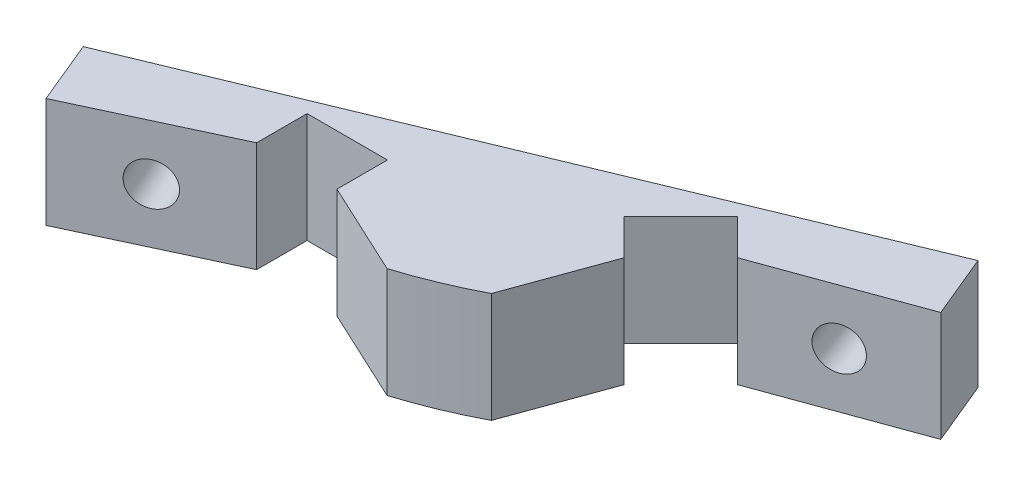
ISO-10303-21;
HEADER;
FILE_DESCRIPTION(('STEP AP214'),'2;1');
FILE_NAME('part.step','',(''),(''),'','','');
FILE_SCHEMA(('AUTOMOTIVE_DESIGN { 1 0 10303 214 1 1 1 1 }'));
ENDSEC;
DATA;
#1=APPLICATION_CONTEXT('core data for automotive mechanical design processes');
#2=APPLICATION_PROTOCOL_DEFINITION('international standard','automotive_design',2000,#1);
#3=PRODUCT_CONTEXT('',#1,'mechanical');
#4=PRODUCT('Part','Part','',(#3));
#5=PRODUCT_RELATED_PRODUCT_CATEGORY('part','',(#4));
#6=PRODUCT_DEFINITION_FORMATION('','',#4);
#7=PRODUCT_DEFINITION_CONTEXT('part definition',#1,'design');
#8=PRODUCT_DEFINITION('design','',#6,#7);
#9=PRODUCT_DEFINITION_SHAPE('','',#8);
#10=(LENGTH_UNIT() NAMED_UNIT(*) SI_UNIT(.MILLI.,.METRE.));
#11=(NAMED_UNIT(*) PLANE_ANGLE_UNIT() SI_UNIT($,.RADIAN.));
#12=(NAMED_UNIT(*) SI_UNIT($,.STERADIAN.) SOLID_ANGLE_UNIT());
#13=UNCERTAINTY_MEASURE_WITH_UNIT(LENGTH_MEASURE(1.E-05),#10,'distance_accuracy_value','');
#14=(GEOMETRIC_REPRESENTATION_CONTEXT(3) GLOBAL_UNCERTAINTY_ASSIGNED_CONTEXT((#13)) GLOBAL_UNIT_ASSIGNED_CONTEXT((#10,
#11,#12)) REPRESENTATION_CONTEXT('',''));
#15=CARTESIAN_POINT('',(0.,0.,0.));
#16=DIRECTION('',(0.,0.,1.));
#17=DIRECTION('',(1.,0.,0.));
#18=AXIS2_PLACEMENT_3D('',#15,#16,#17);
#19=CARTESIAN_POINT('',(20.7924749007934,7.62,12.6238901295778));
#20=DIRECTION('',(-0.342020143325609,0.,-0.93969262078593));
#21=DIRECTION('',(-0.93969262078593,0.,0.342020143325609));
#22=AXIS2_PLACEMENT_3D('',#19,#20,#21);
#23=PLANE('',#22);
#24=DIRECTION('',(0.93969262078593,0.,-0.342020143325609));
#25=VECTOR('',#24,1.);
#26=CARTESIAN_POINT('',(20.7924749007934,0.,12.6238901295778));
#27=LINE('',#26,#25);
#28=CARTESIAN_POINT('',(20.7924749007934,0.,12.6238901295778));
#29=VERTEX_POINT('',#28);
#30=CARTESIAN_POINT('',(31.1144144441,0.,8.86701137591858));
#31=VERTEX_POINT('',#30);
#32=EDGE_CURVE('E282',#29,#31,#27,.T.);
#33=ORIENTED_EDGE('',*,*,#32,.T.);
#34=DIRECTION('',(0.,1.,0.));
#35=VECTOR('',#34,1.);
#36=CARTESIAN_POINT('',(31.1144144441,-10.570963632343,8.86701137591858));
#37=LINE('',#36,#35);
#38=CARTESIAN_POINT('',(31.1144144441,7.62,8.86701137591858));
#39=VERTEX_POINT('',#38);
#40=EDGE_CURVE('E226',#31,#39,#37,.T.);
#41=ORIENTED_EDGE('',*,*,#40,.T.);
#42=DIRECTION('',(0.93969262078593,0.,-0.342020143325609));
#43=VECTOR('',#42,1.);
#44=CARTESIAN_POINT('',(20.7924749007934,7.62,12.6238901295778));
#45=LINE('',#44,#43);
#46=CARTESIAN_POINT('',(20.7924749007934,7.62,12.6238901295778));
#47=VERTEX_POINT('',#46);
#48=EDGE_CURVE('E164',#47,#39,#45,.T.);
#49=ORIENTED_EDGE('',*,*,#48,.F.);
#50=DIRECTION('',(0.,-1.,0.));
#51=VECTOR('',#50,1.);
#52=CARTESIAN_POINT('',(20.7924749007934,7.62,12.6238901295778));
#53=LINE('',#52,#51);
#54=EDGE_CURVE('E293',#47,#29,#53,.T.);
#55=ORIENTED_EDGE('',*,*,#54,.T.);
#56=EDGE_LOOP('',(#33,#41,#49,#55));
#57=FACE_BOUND('',#56,.T.);
#58=CARTESIAN_POINT('',(25.9534446724455,3.81,10.7454507527495));
#59=DIRECTION('',(-0.342020143325853,0.,-0.939692620785841));
#60=DIRECTION('',(-0.939692620785841,0.,0.342020143325853));
#61=AXIS2_PLACEMENT_3D('',#58,#59,#60);
#62=CIRCLE('',#61,1.4732);
#63=CARTESIAN_POINT('',(24.5690895035038,3.81,11.2493148278971));
#64=VERTEX_POINT('',#63);
#65=EDGE_CURVE('E205',#64,#64,#62,.T.);
#66=ORIENTED_EDGE('',*,*,#65,.T.);
#67=EDGE_LOOP('',(#66));
#68=FACE_BOUND('',#67,.T.);
#69=ADVANCED_FACE('F37',(#57,#68),#23,.F.);
#70=CARTESIAN_POINT('',(22.2179051641357,5.461,7.38974578558781));
#71=DIRECTION('',(0.382683432365178,0.,0.92387953251125));
#72=DIRECTION('',(0.92387953251125,0.,-0.382683432365178));
#73=AXIS2_PLACEMENT_3D('',#70,#71,#72);
#74=PLANE('',#73);
#75=DIRECTION('',(0.92387953251125,0.,-0.382683432365178));
#76=VECTOR('',#75,1.);
#77=CARTESIAN_POINT('',(22.2179051641357,7.62,7.38974578558781));
#78=LINE('',#77,#76);
#79=CARTESIAN_POINT('',(-14.5653837667516,7.62,22.6258829294536));
#80=VERTEX_POINT('',#79);
#81=CARTESIAN_POINT('',(29.2892585662248,7.62,4.46069530210858));
#82=VERTEX_POINT('',#81);
#83=EDGE_CURVE('E233',#80,#82,#78,.T.);
#84=ORIENTED_EDGE('',*,*,#83,.T.);
#85=DIRECTION('',(0.,1.,0.));
#86=VECTOR('',#85,1.);
#87=CARTESIAN_POINT('',(29.2892585662248,-10.570963632343,4.46069530210858));
#88=LINE('',#87,#86);
#89=CARTESIAN_POINT('',(29.2892585662248,0.,4.46069530210858));
#90=VERTEX_POINT('',#89);
#91=EDGE_CURVE('E229',#90,#82,#88,.T.);
#92=ORIENTED_EDGE('',*,*,#91,.F.);
#93=DIRECTION('',(0.923879532511251,0.,-0.382683432365177));
#94=VECTOR('',#93,1.);
#95=CARTESIAN_POINT('',(22.2179051641357,0.,7.38974578558781));
#96=LINE('',#95,#94);
#97=CARTESIAN_POINT('',(22.2179051641357,0.,7.38974578558781));
#98=VERTEX_POINT('',#97);
#99=EDGE_CURVE('E223',#98,#90,#96,.T.);
#100=ORIENTED_EDGE('',*,*,#99,.F.);
#101=DIRECTION('',(0.,1.,0.));
#102=VECTOR('',#101,1.);
#103=CARTESIAN_POINT('',(22.2179051641357,-10.570963632343,7.38974578558781));
#104=LINE('',#103,#102);
#105=CARTESIAN_POINT('',(22.2179051641357,5.461,7.38974578558781));
#106=VERTEX_POINT('',#105);
#107=EDGE_CURVE('E54',#98,#106,#104,.T.);
#108=ORIENTED_EDGE('',*,*,#107,.T.);
#109=DIRECTION('',(0.92387953251125,0.,-0.382683432365178));
#110=VECTOR('',#109,1.);
#111=CARTESIAN_POINT('',(22.2179051641357,5.461,7.38974578558781));
#112=LINE('',#111,#110);
#113=CARTESIAN_POINT('',(-7.49403036466243,5.461,19.6968324459743));
#114=VERTEX_POINT('',#113);
#115=EDGE_CURVE('E177',#114,#106,#112,.T.);
#116=ORIENTED_EDGE('',*,*,#115,.F.);
#117=DIRECTION('',(0.,1.,0.));
#118=VECTOR('',#117,1.);
#119=CARTESIAN_POINT('',(-7.49403036466243,-10.570963632343,19.6968324459743));
#120=LINE('',#119,#118);
#121=CARTESIAN_POINT('',(-7.49403036466243,0.,19.6968324459743));
#122=VERTEX_POINT('',#121);
#123=EDGE_CURVE('E198',#122,#114,#120,.T.);
#124=ORIENTED_EDGE('',*,*,#123,.F.);
#125=DIRECTION('',(0.92387953251125,0.,-0.382683432365178));
#126=VECTOR('',#125,1.);
#127=CARTESIAN_POINT('',(-7.49403036466243,0.,19.6968324459743));
#128=LINE('',#127,#126);
#129=CARTESIAN_POINT('',(-14.5653837667516,0.,22.6258829294536));
#130=VERTEX_POINT('',#129);
#131=EDGE_CURVE('E186',#130,#122,#128,.T.);
#132=ORIENTED_EDGE('',*,*,#131,.F.);
#133=DIRECTION('',(0.,1.,0.));
#134=VECTOR('',#133,1.);
#135=CARTESIAN_POINT('',(-14.5653837667516,-10.570963632343,22.6258829294536));
#136=LINE('',#135,#134);
#137=EDGE_CURVE('E213',#130,#80,#136,.T.);
#138=ORIENTED_EDGE('',*,*,#137,.T.);
#139=EDGE_LOOP('',(#84,#92,#100,#108,#116,#124,#132,#138));
#140=FACE_BOUND('',#139,.T.);
#141=CARTESIAN_POINT('',(-9.67881234402094,3.81,20.6017987726532));
#142=DIRECTION('',(0.382683432365178,0.,0.92387953251125));
#143=DIRECTION('',(0.92387953251125,0.,-0.382683432365178));
#144=AXIS2_PLACEMENT_3D('',#141,#142,#143);
#145=ELLIPSE('',#144,1.4746034957826,1.4732);
#146=CARTESIAN_POINT('',(-8.31645635569786,3.81,20.0374924455094));
#147=VERTEX_POINT('',#146);
#148=EDGE_CURVE('E192',#147,#147,#145,.T.);
#149=ORIENTED_EDGE('',*,*,#148,.T.);
#150=EDGE_LOOP('',(#149));
#151=FACE_BOUND('',#150,.T.);
#152=CARTESIAN_POINT('',(24.4026871434941,3.81,6.48477945890895));
#153=DIRECTION('',(0.382683432365178,0.,0.92387953251125));
#154=DIRECTION('',(-0.92387953251125,0.,0.382683432365178));
#155=AXIS2_PLACEMENT_3D('',#152,#153,#154);
#156=ELLIPSE('',#155,1.4746034957826,1.4732);
#157=CARTESIAN_POINT('',(23.0403311551711,3.81,7.04908578605272));
#158=VERTEX_POINT('',#157);
#159=EDGE_CURVE('E41',#158,#158,#156,.F.);
#160=ORIENTED_EDGE('',*,*,#159,.F.);
#161=EDGE_LOOP('',(#160));
#162=FACE_BOUND('',#161,.T.);
#163=ADVANCED_FACE('F349',(#140,#151,#162),#74,.F.);
#164=CARTESIAN_POINT('',(27.5341855589059,7.62,10.1701081219901));
#165=DIRECTION('',(-0.463437159403285,0.,0.886129786929778));
#166=DIRECTION('',(0.886129786929778,0.,0.463437159403285));
#167=AXIS2_PLACEMENT_3D('',#164,#165,#166);
#168=PLANE('',#167);
#169=ORIENTED_EDGE('',*,*,#107,.F.);
#170=DIRECTION('',(-0.886129786929778,0.,-0.463437159403285));
#171=VECTOR('',#170,1.);
#172=CARTESIAN_POINT('',(27.5341855589059,0.,10.1701081219901));
#173=LINE('',#172,#171);
#174=CARTESIAN_POINT('',(19.152394428167,0.,5.78651383406991));
#175=VERTEX_POINT('',#174);
#176=EDGE_CURVE('E279',#98,#175,#173,.T.);
#177=ORIENTED_EDGE('',*,*,#176,.T.);
#178=DIRECTION('',(0.,-1.,0.));
#179=VECTOR('',#178,1.);
#180=CARTESIAN_POINT('',(19.152394428167,7.62,5.78651383406991));
#181=LINE('',#180,#179);
#182=CARTESIAN_POINT('',(19.152394428167,5.461,5.78651383406991));
#183=VERTEX_POINT('',#182);
#184=EDGE_CURVE('E290',#183,#175,#181,.T.);
#185=ORIENTED_EDGE('',*,*,#184,.F.);
#186=DIRECTION('',(-0.886129786929778,0.,-0.463437159403285));
#187=VECTOR('',#186,1.);
#188=CARTESIAN_POINT('',(19.1505615139966,5.461,5.7855552379939));
#189=LINE('',#188,#187);
#190=EDGE_CURVE('E183',#106,#183,#189,.T.);
#191=ORIENTED_EDGE('',*,*,#190,.F.);
#192=EDGE_LOOP('',(#169,#177,#185,#191));
#193=FACE_BOUND('',#192,.T.);
#194=ADVANCED_FACE('F355',(#193),#168,.F.);
#195=CARTESIAN_POINT('',(-9.28719522026678,7.62,25.4220234260315));
#196=DIRECTION('',(0.954287939417387,0.,0.298888823281361));
#197=DIRECTION('',(0.298888823281361,0.,-0.954287939417388));
#198=AXIS2_PLACEMENT_3D('',#195,#196,#197);
#199=PLANE('',#198);
#200=DIRECTION('',(-0.298888823281361,0.,0.954287939417387));
#201=VECTOR('',#200,1.);
#202=CARTESIAN_POINT('',(-9.28719522026678,0.,25.4220234260315));
#203=LINE('',#202,#201);
#204=CARTESIAN_POINT('',(-6.46004312019274,0.,16.3955328320373));
#205=VERTEX_POINT('',#204);
#206=EDGE_CURVE('E174',#205,#122,#203,.T.);
#207=ORIENTED_EDGE('',*,*,#206,.T.);
#208=ORIENTED_EDGE('',*,*,#123,.T.);
#209=DIRECTION('',(-0.298888823281361,0.,0.954287939417388));
#210=VECTOR('',#209,1.);
#211=CARTESIAN_POINT('',(-6.45942488393924,5.461,16.3935589362123));
#212=LINE('',#211,#210);
#213=CARTESIAN_POINT('',(-6.46004312019274,5.461,16.3955328320373));
#214=VERTEX_POINT('',#213);
#215=EDGE_CURVE('E180',#214,#114,#212,.T.);
#216=ORIENTED_EDGE('',*,*,#215,.F.);
#217=DIRECTION('',(0.,-1.,0.));
#218=VECTOR('',#217,1.);
#219=CARTESIAN_POINT('',(-6.46004312019274,7.62,16.3955328320373));
#220=LINE('',#219,#218);
#221=EDGE_CURVE('E108',#214,#205,#220,.T.);
#222=ORIENTED_EDGE('',*,*,#221,.T.);
#223=EDGE_LOOP('',(#207,#208,#216,#222));
#224=FACE_BOUND('',#223,.T.);
#225=ADVANCED_FACE('F39',(#224),#199,.F.);
#226=CARTESIAN_POINT('',(-2.78499999999602,7.62,22.3900000000004));
#227=DIRECTION('',(-0.422618261740698,0.,-0.906307787036651));
#228=DIRECTION('',(-0.906307787036651,0.,0.422618261740698));
#229=AXIS2_PLACEMENT_3D('',#226,#227,#228);
#230=PLANE('',#229);
#231=CARTESIAN_POINT('',(-7.76261394443621,3.81,24.711099501632));
#232=DIRECTION('',(0.422618261740698,0.,0.906307787036651));
#233=DIRECTION('',(0.906307787036651,0.,-0.422618261740698));
#234=AXIS2_PLACEMENT_3D('',#231,#232,#233);
#235=CIRCLE('',#234,1.4732);
#236=CARTESIAN_POINT('',(-6.42744131257382,3.81,24.0884982784356));
#237=VERTEX_POINT('',#236);
#238=EDGE_CURVE('E195',#237,#237,#235,.T.);
#239=ORIENTED_EDGE('',*,*,#238,.F.);
#240=EDGE_LOOP('',(#239));
#241=FACE_BOUND('',#240,.T.);
#242=DIRECTION('',(0.906307787036651,0.,-0.422618261740698));
#243=VECTOR('',#242,1.);
#244=CARTESIAN_POINT('',(-2.78499999999602,0.,22.3900000000004));
#245=LINE('',#244,#243);
#246=CARTESIAN_POINT('',(-12.7402278888764,0.,27.0321990032636));
#247=VERTEX_POINT('',#246);
#248=CARTESIAN_POINT('',(-2.78499999999602,0.,22.3900000000004));
#249=VERTEX_POINT('',#248);
#250=EDGE_CURVE('E171',#247,#249,#245,.T.);
#251=ORIENTED_EDGE('',*,*,#250,.T.);
#252=DIRECTION('',(0.,-1.,0.));
#253=VECTOR('',#252,1.);
#254=CARTESIAN_POINT('',(-2.78499999999602,7.62,22.3900000000004));
#255=LINE('',#254,#253);
#256=CARTESIAN_POINT('',(-2.78499999999602,7.62,22.3900000000004));
#257=VERTEX_POINT('',#256);
#258=EDGE_CURVE('E46',#257,#249,#255,.T.);
#259=ORIENTED_EDGE('',*,*,#258,.F.);
#260=DIRECTION('',(0.906307787036651,0.,-0.422618261740698));
#261=VECTOR('',#260,1.);
#262=CARTESIAN_POINT('',(-2.78499999999602,7.62,22.3900000000004));
#263=LINE('',#262,#261);
#264=CARTESIAN_POINT('',(-12.7402278888764,7.62,27.0321990032636));
#265=VERTEX_POINT('',#264);
#266=EDGE_CURVE('E116',#265,#257,#263,.T.);
#267=ORIENTED_EDGE('',*,*,#266,.F.);
#268=DIRECTION('',(0.,1.,0.));
#269=VECTOR('',#268,1.);
#270=CARTESIAN_POINT('',(-12.7402278888764,-10.570963632343,27.0321990032636));
#271=LINE('',#270,#269);
#272=EDGE_CURVE('E190',#247,#265,#271,.T.);
#273=ORIENTED_EDGE('',*,*,#272,.F.);
#274=EDGE_LOOP('',(#251,#259,#267,#273));
#275=FACE_BOUND('',#274,.T.);
#276=ADVANCED_FACE('F323',(#241,#275),#230,.F.);
#277=CARTESIAN_POINT('',(-2.78499999999602,7.62,18.8900000000005));
#278=DIRECTION('',(-1.,0.,0.));
#279=DIRECTION('',(0.,0.,1.));
#280=AXIS2_PLACEMENT_3D('',#277,#278,#279);
#281=PLANE('',#280);
#282=DIRECTION('',(0.,0.,-1.));
#283=VECTOR('',#282,1.);
#284=CARTESIAN_POINT('',(-2.78499999999602,0.,18.8900000000005));
#285=LINE('',#284,#283);
#286=CARTESIAN_POINT('',(-2.78499999999602,0.,18.8900000000005));
#287=VERTEX_POINT('',#286);
#288=EDGE_CURVE('E315',#249,#287,#285,.T.);
#289=ORIENTED_EDGE('',*,*,#288,.T.);
#290=DIRECTION('',(0.,-1.,0.));
#291=VECTOR('',#290,1.);
#292=CARTESIAN_POINT('',(-2.78499999999602,7.62,18.8900000000005));
#293=LINE('',#292,#291);
#294=CARTESIAN_POINT('',(-2.78499999999602,7.62,18.8900000000005));
#295=VERTEX_POINT('',#294);
#296=EDGE_CURVE('E274',#295,#287,#293,.T.);
#297=ORIENTED_EDGE('',*,*,#296,.F.);
#298=DIRECTION('',(0.,0.,-1.));
#299=VECTOR('',#298,1.);
#300=CARTESIAN_POINT('',(-2.78499999999602,7.62,18.8900000000005));
#301=LINE('',#300,#299);
#302=EDGE_CURVE('E237',#257,#295,#301,.T.);
#303=ORIENTED_EDGE('',*,*,#302,.F.);
#304=ORIENTED_EDGE('',*,*,#258,.T.);
#305=EDGE_LOOP('',(#289,#297,#303,#304));
#306=FACE_BOUND('',#305,.T.);
#307=ADVANCED_FACE('F327',(#306),#281,.F.);
#308=CARTESIAN_POINT('',(1.49211910891068E-12,7.62,18.8900000000005));
#309=DIRECTION('',(0.,0.,-1.));
#310=DIRECTION('',(-1.,0.,0.));
#311=AXIS2_PLACEMENT_3D('',#308,#309,#310);
#312=PLANE('',#311);
#313=DIRECTION('',(1.,0.,0.));
#314=VECTOR('',#313,1.);
#315=CARTESIAN_POINT('',(1.49211910891068E-12,0.,18.8900000000005));
#316=LINE('',#315,#314);
#317=CARTESIAN_POINT('',(2.78500000000462,0.,18.8900000000005));
#318=VERTEX_POINT('',#317);
#319=EDGE_CURVE('E314',#287,#318,#316,.T.);
#320=ORIENTED_EDGE('',*,*,#319,.T.);
#321=DIRECTION('',(0.,-1.,0.));
#322=VECTOR('',#321,1.);
#323=CARTESIAN_POINT('',(2.78500000000462,7.62,18.8900000000005));
#324=LINE('',#323,#322);
#325=CARTESIAN_POINT('',(2.78500000000462,7.62,18.8900000000005));
#326=VERTEX_POINT('',#325);
#327=EDGE_CURVE('E271',#326,#318,#324,.T.);
#328=ORIENTED_EDGE('',*,*,#327,.F.);
#329=DIRECTION('',(1.,0.,0.));
#330=VECTOR('',#329,1.);
#331=CARTESIAN_POINT('',(1.49211910891068E-12,7.62,18.8900000000005));
#332=LINE('',#331,#330);
#333=EDGE_CURVE('E240',#295,#326,#332,.T.);
#334=ORIENTED_EDGE('',*,*,#333,.F.);
#335=ORIENTED_EDGE('',*,*,#296,.T.);
#336=EDGE_LOOP('',(#320,#328,#334,#335));
#337=FACE_BOUND('',#336,.T.);
#338=ADVANCED_FACE('F332',(#337),#312,.F.);
#339=CARTESIAN_POINT('',(2.78500000000462,7.62,18.8900000000005));
#340=DIRECTION('',(1.,0.,0.));
#341=DIRECTION('',(0.,0.,-1.));
#342=AXIS2_PLACEMENT_3D('',#339,#340,#341);
#343=PLANE('',#342);
#344=DIRECTION('',(0.,0.,1.));
#345=VECTOR('',#344,1.);
#346=CARTESIAN_POINT('',(2.78500000000462,0.,18.8900000000005));
#347=LINE('',#346,#345);
#348=CARTESIAN_POINT('',(2.78500000000462,0.,22.3899999999995));
#349=VERTEX_POINT('',#348);
#350=EDGE_CURVE('E312',#318,#349,#347,.T.);
#351=ORIENTED_EDGE('',*,*,#350,.T.);
#352=DIRECTION('',(0.,-1.,0.));
#353=VECTOR('',#352,1.);
#354=CARTESIAN_POINT('',(2.78500000000462,7.62,22.3899999999995));
#355=LINE('',#354,#353);
#356=CARTESIAN_POINT('',(2.78500000000462,7.62,22.3899999999995));
#357=VERTEX_POINT('',#356);
#358=EDGE_CURVE('E268',#357,#349,#355,.T.);
#359=ORIENTED_EDGE('',*,*,#358,.F.);
#360=DIRECTION('',(0.,0.,1.));
#361=VECTOR('',#360,1.);
#362=CARTESIAN_POINT('',(2.78500000000462,7.62,18.8900000000005));
#363=LINE('',#362,#361);
#364=EDGE_CURVE('E242',#326,#357,#363,.T.);
#365=ORIENTED_EDGE('',*,*,#364,.F.);
#366=ORIENTED_EDGE('',*,*,#327,.T.);
#367=EDGE_LOOP('',(#351,#359,#365,#366));
#368=FACE_BOUND('',#367,.T.);
#369=ADVANCED_FACE('F336',(#368),#343,.F.);
#370=CARTESIAN_POINT('',(2.78500000000462,7.62,22.3899999999995));
#371=DIRECTION('',(0.422618261740758,0.,-0.906307787036623));
#372=DIRECTION('',(-0.906307787036623,0.,-0.422618261740758));
#373=AXIS2_PLACEMENT_3D('',#370,#371,#372);
#374=PLANE('',#373);
#375=DIRECTION('',(0.906307787036623,0.,0.422618261740758));
#376=VECTOR('',#375,1.);
#377=CARTESIAN_POINT('',(2.78500000000462,0.,22.3899999999995));
#378=LINE('',#377,#376);
#379=CARTESIAN_POINT('',(9.28719522027243,0.,25.4220234260297));
#380=VERTEX_POINT('',#379);
#381=EDGE_CURVE('E310',#349,#380,#378,.T.);
#382=ORIENTED_EDGE('',*,*,#381,.T.);
#383=DIRECTION('',(0.,-1.,0.));
#384=VECTOR('',#383,1.);
#385=CARTESIAN_POINT('',(9.28719522027243,7.62,25.4220234260297));
#386=LINE('',#385,#384);
#387=CARTESIAN_POINT('',(9.28719522027243,7.62,25.4220234260297));
#388=VERTEX_POINT('',#387);
#389=EDGE_CURVE('E260',#388,#380,#386,.T.);
#390=ORIENTED_EDGE('',*,*,#389,.F.);
#391=DIRECTION('',(0.906307787036623,0.,0.422618261740758));
#392=VECTOR('',#391,1.);
#393=CARTESIAN_POINT('',(2.78500000000462,7.62,22.3899999999995));
#394=LINE('',#393,#392);
#395=EDGE_CURVE('E244',#357,#388,#394,.T.);
#396=ORIENTED_EDGE('',*,*,#395,.F.);
#397=ORIENTED_EDGE('',*,*,#358,.T.);
#398=EDGE_LOOP('',(#382,#390,#396,#397));
#399=FACE_BOUND('',#398,.T.);
#400=ADVANCED_FACE('F339',(#399),#374,.F.);
#401=CARTESIAN_POINT('',(1.48928772551105E-12,7.62,-4.22999999999638));
#402=DIRECTION('',(0.,-1.,0.));
#403=DIRECTION('',(0.,0.,-1.));
#404=AXIS2_PLACEMENT_3D('',#401,#402,#403);
#405=CYLINDRICAL_SURFACE('',#404,31.0724071857496);
#406=CARTESIAN_POINT('',(1.48928772551105E-12,0.,-4.22999999999638));
#407=DIRECTION('',(0.,1.,0.));
#408=DIRECTION('',(0.,0.,1.));
#409=AXIS2_PLACEMENT_3D('',#406,#407,#408);
#410=CIRCLE('',#409,31.0724071857496);
#411=CARTESIAN_POINT('',(14.4001081219953,0.,23.3041855589032));
#412=VERTEX_POINT('',#411);
#413=EDGE_CURVE('E257',#380,#412,#410,.T.);
#414=ORIENTED_EDGE('',*,*,#413,.T.);
#415=DIRECTION('',(0.,-1.,0.));
#416=VECTOR('',#415,1.);
#417=CARTESIAN_POINT('',(14.4001081219953,7.62,23.3041855589032));
#418=LINE('',#417,#416);
#419=CARTESIAN_POINT('',(14.4001081219953,7.62,23.3041855589032));
#420=VERTEX_POINT('',#419);
#421=EDGE_CURVE('E254',#420,#412,#418,.T.);
#422=ORIENTED_EDGE('',*,*,#421,.F.);
#423=CARTESIAN_POINT('',(1.48928772551105E-12,7.62,-4.22999999999638));
#424=DIRECTION('',(0.,1.,0.));
#425=DIRECTION('',(0.,0.,1.));
#426=AXIS2_PLACEMENT_3D('',#423,#424,#425);
#427=CIRCLE('',#426,31.0724071857496);
#428=EDGE_CURVE('E246',#388,#420,#427,.T.);
#429=ORIENTED_EDGE('',*,*,#428,.F.);
#430=ORIENTED_EDGE('',*,*,#389,.T.);
#431=EDGE_LOOP('',(#414,#422,#429,#430));
#432=FACE_BOUND('',#431,.T.);
#433=ADVANCED_FACE('F255',(#432),#405,.T.);
#434=CARTESIAN_POINT('',(16.8538901295845,7.62,16.5624749007879));
#435=DIRECTION('',(-0.939692620785908,0.,-0.34202014332567));
#436=DIRECTION('',(-0.34202014332567,0.,0.939692620785908));
#437=AXIS2_PLACEMENT_3D('',#434,#435,#436);
#438=PLANE('',#437);
#439=DIRECTION('',(0.34202014332567,0.,-0.939692620785908));
#440=VECTOR('',#439,1.);
#441=CARTESIAN_POINT('',(16.8538901295845,0.,16.5624749007879));
#442=LINE('',#441,#440);
#443=CARTESIAN_POINT('',(16.8538901295845,0.,16.5624749007879));
#444=VERTEX_POINT('',#443);
#445=EDGE_CURVE('E263',#412,#444,#442,.T.);
#446=ORIENTED_EDGE('',*,*,#445,.T.);
#447=DIRECTION('',(0.,-1.,0.));
#448=VECTOR('',#447,1.);
#449=CARTESIAN_POINT('',(16.8538901295845,7.62,16.5624749007879));
#450=LINE('',#449,#448);
#451=CARTESIAN_POINT('',(16.8538901295845,7.62,16.5624749007879));
#452=VERTEX_POINT('',#451);
#453=EDGE_CURVE('E158',#452,#444,#450,.T.);
#454=ORIENTED_EDGE('',*,*,#453,.F.);
#455=DIRECTION('',(0.34202014332567,0.,-0.939692620785908));
#456=VECTOR('',#455,1.);
#457=CARTESIAN_POINT('',(16.8538901295845,7.62,16.5624749007879));
#458=LINE('',#457,#456);
#459=EDGE_CURVE('E146',#420,#452,#458,.T.);
#460=ORIENTED_EDGE('',*,*,#459,.F.);
#461=ORIENTED_EDGE('',*,*,#421,.T.);
#462=EDGE_LOOP('',(#446,#454,#460,#461));
#463=FACE_BOUND('',#462,.T.);
#464=ADVANCED_FACE('F262',(#463),#438,.F.);
#465=CARTESIAN_POINT('',(14.3790163954316,7.62,14.087601166635));
#466=DIRECTION('',(-0.707106781186549,0.,0.707106781186547));
#467=DIRECTION('',(0.707106781186547,0.,0.707106781186549));
#468=AXIS2_PLACEMENT_3D('',#465,#466,#467);
#469=PLANE('',#468);
#470=DIRECTION('',(-0.707106781186547,0.,-0.707106781186549));
#471=VECTOR('',#470,1.);
#472=CARTESIAN_POINT('',(14.3790163954316,0.,14.087601166635));
#473=LINE('',#472,#471);
#474=CARTESIAN_POINT('',(14.3790163954316,0.,14.087601166635));
#475=VERTEX_POINT('',#474);
#476=EDGE_CURVE('E156',#444,#475,#473,.T.);
#477=ORIENTED_EDGE('',*,*,#476,.T.);
#478=DIRECTION('',(0.,-1.,0.));
#479=VECTOR('',#478,1.);
#480=CARTESIAN_POINT('',(14.3790163954316,7.62,14.087601166635));
#481=LINE('',#480,#479);
#482=CARTESIAN_POINT('',(14.3790163954316,7.62,14.087601166635));
#483=VERTEX_POINT('',#482);
#484=EDGE_CURVE('E153',#483,#475,#481,.T.);
#485=ORIENTED_EDGE('',*,*,#484,.F.);
#486=DIRECTION('',(-0.707106781186547,0.,-0.707106781186549));
#487=VECTOR('',#486,1.);
#488=CARTESIAN_POINT('',(14.3790163954316,7.62,14.087601166635));
#489=LINE('',#488,#487);
#490=EDGE_CURVE('E138',#452,#483,#489,.T.);
#491=ORIENTED_EDGE('',*,*,#490,.F.);
#492=ORIENTED_EDGE('',*,*,#453,.T.);
#493=EDGE_LOOP('',(#477,#485,#491,#492));
#494=FACE_BOUND('',#493,.T.);
#495=ADVANCED_FACE('F154',(#494),#469,.F.);
#496=CARTESIAN_POINT('',(16.3483087810344,7.62,12.1183087810323));
#497=DIRECTION('',(-0.707106781186547,0.,-0.707106781186548));
#498=DIRECTION('',(-0.707106781186548,0.,0.707106781186547));
#499=AXIS2_PLACEMENT_3D('',#496,#497,#498);
#500=PLANE('',#499);
#501=DIRECTION('',(0.707106781186548,0.,-0.707106781186547));
#502=VECTOR('',#501,1.);
#503=CARTESIAN_POINT('',(16.3483087810344,0.,12.1183087810323));
#504=LINE('',#503,#502);
#505=CARTESIAN_POINT('',(18.3176011666411,0.,10.1490163954255));
#506=VERTEX_POINT('',#505);
#507=EDGE_CURVE('E303',#475,#506,#504,.T.);
#508=ORIENTED_EDGE('',*,*,#507,.T.);
#509=DIRECTION('',(0.,-1.,0.));
#510=VECTOR('',#509,1.);
#511=CARTESIAN_POINT('',(18.3176011666411,7.62,10.1490163954255));
#512=LINE('',#511,#510);
#513=CARTESIAN_POINT('',(18.3176011666411,7.62,10.1490163954255));
#514=VERTEX_POINT('',#513);
#515=EDGE_CURVE('E159',#514,#506,#512,.T.);
#516=ORIENTED_EDGE('',*,*,#515,.F.);
#517=DIRECTION('',(0.707106781186547,0.,-0.707106781186548));
#518=VECTOR('',#517,1.);
#519=CARTESIAN_POINT('',(16.3483087810344,7.62,12.1183087810323));
#520=LINE('',#519,#518);
#521=EDGE_CURVE('E143',#483,#514,#520,.T.);
#522=ORIENTED_EDGE('',*,*,#521,.F.);
#523=ORIENTED_EDGE('',*,*,#484,.T.);
#524=EDGE_LOOP('',(#508,#516,#522,#523));
#525=FACE_BOUND('',#524,.T.);
#526=ADVANCED_FACE('F161',(#525),#500,.F.);
#527=CARTESIAN_POINT('',(18.3176011666411,7.62,10.1490163954255));
#528=DIRECTION('',(0.707106781186548,0.,-0.707106781186547));
#529=DIRECTION('',(-0.707106781186547,0.,-0.707106781186548));
#530=AXIS2_PLACEMENT_3D('',#527,#528,#529);
#531=PLANE('',#530);
#532=DIRECTION('',(0.707106781186547,0.,0.707106781186548));
#533=VECTOR('',#532,1.);
#534=CARTESIAN_POINT('',(18.3176011666411,0.,10.1490163954255));
#535=LINE('',#534,#533);
#536=EDGE_CURVE('E298',#506,#29,#535,.T.);
#537=ORIENTED_EDGE('',*,*,#536,.T.);
#538=ORIENTED_EDGE('',*,*,#54,.F.);
#539=DIRECTION('',(0.707106781186547,0.,0.707106781186548));
#540=VECTOR('',#539,1.);
#541=CARTESIAN_POINT('',(18.3176011666411,7.62,10.1490163954255));
#542=LINE('',#541,#540);
#543=EDGE_CURVE('E63',#514,#47,#542,.T.);
#544=ORIENTED_EDGE('',*,*,#543,.F.);
#545=ORIENTED_EDGE('',*,*,#515,.T.);
#546=EDGE_LOOP('',(#537,#538,#544,#545));
#547=FACE_BOUND('',#546,.T.);
#548=ADVANCED_FACE('F297',(#547),#531,.F.);
#549=CARTESIAN_POINT('',(-6.46004312019274,7.62,16.3955328320373));
#550=DIRECTION('',(0.382683432365178,0.,0.92387953251125));
#551=DIRECTION('',(0.92387953251125,0.,-0.382683432365178));
#552=AXIS2_PLACEMENT_3D('',#549,#550,#551);
#553=PLANE('',#552);
#554=ORIENTED_EDGE('',*,*,#221,.F.);
#555=DIRECTION('',(0.92387953251125,0.,-0.382683432365178));
#556=VECTOR('',#555,1.);
#557=CARTESIAN_POINT('',(-6.46004312019274,5.461,16.3955328320373));
#558=LINE('',#557,#556);
#559=EDGE_CURVE('E11',#214,#183,#558,.T.);
#560=ORIENTED_EDGE('',*,*,#559,.T.);
#561=ORIENTED_EDGE('',*,*,#184,.T.);
#562=DIRECTION('',(-0.92387953251125,0.,0.382683432365178));
#563=VECTOR('',#562,1.);
#564=CARTESIAN_POINT('',(-6.46004312019274,0.,16.3955328320373));
#565=LINE('',#564,#563);
#566=EDGE_CURVE('E238',#175,#205,#565,.T.);
#567=ORIENTED_EDGE('',*,*,#566,.T.);
#568=EDGE_LOOP('',(#554,#560,#561,#567));
#569=FACE_BOUND('',#568,.T.);
#570=ADVANCED_FACE('F364',(#569),#553,.F.);
#571=CARTESIAN_POINT('',(1.48928772551105E-12,7.62,-4.22999999999638));
#572=DIRECTION('',(0.,1.,0.));
#573=DIRECTION('',(0.,0.,1.));
#574=AXIS2_PLACEMENT_3D('',#571,#572,#573);
#575=PLANE('',#574);
#576=ORIENTED_EDGE('',*,*,#83,.F.);
#577=DIRECTION('',(0.382683432365178,0.,0.92387953251125));
#578=VECTOR('',#577,1.);
#579=CARTESIAN_POINT('',(-12.7402278888764,7.62,27.0321990032636));
#580=LINE('',#579,#578);
#581=EDGE_CURVE('E194',#80,#265,#580,.T.);
#582=ORIENTED_EDGE('',*,*,#581,.T.);
#583=ORIENTED_EDGE('',*,*,#266,.T.);
#584=ORIENTED_EDGE('',*,*,#302,.T.);
#585=ORIENTED_EDGE('',*,*,#333,.T.);
#586=ORIENTED_EDGE('',*,*,#364,.T.);
#587=ORIENTED_EDGE('',*,*,#395,.T.);
#588=ORIENTED_EDGE('',*,*,#428,.T.);
#589=ORIENTED_EDGE('',*,*,#459,.T.);
#590=ORIENTED_EDGE('',*,*,#490,.T.);
#591=ORIENTED_EDGE('',*,*,#521,.T.);
#592=ORIENTED_EDGE('',*,*,#543,.T.);
#593=ORIENTED_EDGE('',*,*,#48,.T.);
#594=DIRECTION('',(-0.382683432365178,0.,-0.92387953251125));
#595=VECTOR('',#594,1.);
#596=CARTESIAN_POINT('',(31.1144144441,7.62,8.86701137591858));
#597=LINE('',#596,#595);
#598=EDGE_CURVE('E209',#39,#82,#597,.T.);
#599=ORIENTED_EDGE('',*,*,#598,.T.);
#600=EDGE_LOOP('',(#576,#582,#583,#584,#585,#586,#587,#588,#589,#590,#591,#592,#593,#599));
#601=FACE_BOUND('',#600,.T.);
#602=ADVANCED_FACE('F141',(#601),#575,.T.);
#603=CARTESIAN_POINT('',(1.48928772551105E-12,0.,-4.22999999999638));
#604=DIRECTION('',(0.,1.,0.));
#605=DIRECTION('',(0.,0.,1.));
#606=AXIS2_PLACEMENT_3D('',#603,#604,#605);
#607=PLANE('',#606);
#608=ORIENTED_EDGE('',*,*,#206,.F.);
#609=ORIENTED_EDGE('',*,*,#566,.F.);
#610=ORIENTED_EDGE('',*,*,#176,.F.);
#611=ORIENTED_EDGE('',*,*,#99,.T.);
#612=DIRECTION('',(0.382683432365178,0.,0.92387953251125));
#613=VECTOR('',#612,1.);
#614=CARTESIAN_POINT('',(31.1144144441,0.,8.86701137591858));
#615=LINE('',#614,#613);
#616=EDGE_CURVE('E220',#90,#31,#615,.T.);
#617=ORIENTED_EDGE('',*,*,#616,.T.);
#618=ORIENTED_EDGE('',*,*,#32,.F.);
#619=ORIENTED_EDGE('',*,*,#536,.F.);
#620=ORIENTED_EDGE('',*,*,#507,.F.);
#621=ORIENTED_EDGE('',*,*,#476,.F.);
#622=ORIENTED_EDGE('',*,*,#445,.F.);
#623=ORIENTED_EDGE('',*,*,#413,.F.);
#624=ORIENTED_EDGE('',*,*,#381,.F.);
#625=ORIENTED_EDGE('',*,*,#350,.F.);
#626=ORIENTED_EDGE('',*,*,#319,.F.);
#627=ORIENTED_EDGE('',*,*,#288,.F.);
#628=ORIENTED_EDGE('',*,*,#250,.F.);
#629=DIRECTION('',(-0.382683432365178,0.,-0.92387953251125));
#630=VECTOR('',#629,1.);
#631=CARTESIAN_POINT('',(-12.7402278888764,0.,27.0321990032636));
#632=LINE('',#631,#630);
#633=EDGE_CURVE('E189',#247,#130,#632,.T.);
#634=ORIENTED_EDGE('',*,*,#633,.T.);
#635=ORIENTED_EDGE('',*,*,#131,.T.);
#636=EDGE_LOOP('',(#608,#609,#610,#611,#617,#618,#619,#620,#621,#622,#623,#624,#625,#626,#627,
#628,#634,#635));
#637=FACE_BOUND('',#636,.T.);
#638=ADVANCED_FACE('F302',(#637),#607,.F.);
#639=CARTESIAN_POINT('',(1.48665801891212E-12,5.461,-4.22999999999639));
#640=DIRECTION('',(0.,-1.,0.));
#641=DIRECTION('',(0.,0.,-1.));
#642=AXIS2_PLACEMENT_3D('',#639,#640,#641);
#643=PLANE('',#642);
#644=ORIENTED_EDGE('',*,*,#215,.T.);
#645=ORIENTED_EDGE('',*,*,#115,.T.);
#646=ORIENTED_EDGE('',*,*,#190,.T.);
#647=ORIENTED_EDGE('',*,*,#559,.F.);
#648=EDGE_LOOP('',(#644,#645,#646,#647));
#649=FACE_BOUND('',#648,.T.);
#650=ADVANCED_FACE('F406',(#649),#643,.F.);
#651=CARTESIAN_POINT('',(31.1144144441,-10.570963632343,8.86701137591858));
#652=DIRECTION('',(0.92387953251125,0.,-0.382683432365178));
#653=DIRECTION('',(-0.382683432365178,0.,-0.92387953251125));
#654=AXIS2_PLACEMENT_3D('',#651,#652,#653);
#655=PLANE('',#654);
#656=ORIENTED_EDGE('',*,*,#616,.F.);
#657=ORIENTED_EDGE('',*,*,#91,.T.);
#658=ORIENTED_EDGE('',*,*,#598,.F.);
#659=ORIENTED_EDGE('',*,*,#40,.F.);
#660=EDGE_LOOP('',(#656,#657,#658,#659));
#661=FACE_BOUND('',#660,.T.);
#662=ADVANCED_FACE('F413',(#661),#655,.T.);
#663=CARTESIAN_POINT('',(-12.7402278888764,-10.570963632343,27.0321990032636));
#664=DIRECTION('',(-0.92387953251125,0.,0.382683432365178));
#665=DIRECTION('',(0.382683432365178,0.,0.92387953251125));
#666=AXIS2_PLACEMENT_3D('',#663,#664,#665);
#667=PLANE('',#666);
#668=ORIENTED_EDGE('',*,*,#633,.F.);
#669=ORIENTED_EDGE('',*,*,#272,.T.);
#670=ORIENTED_EDGE('',*,*,#581,.F.);
#671=ORIENTED_EDGE('',*,*,#137,.F.);
#672=EDGE_LOOP('',(#668,#669,#670,#671));
#673=FACE_BOUND('',#672,.T.);
#674=ADVANCED_FACE('F421',(#673),#667,.T.);
#675=CARTESIAN_POINT('',(-16.7339996236164,3.81,5.47190082606956));
#676=DIRECTION('',(0.422618261740698,0.,0.906307787036651));
#677=DIRECTION('',(0.906307787036651,0.,-0.422618261740698));
#678=AXIS2_PLACEMENT_3D('',#675,#676,#677);
#679=CYLINDRICAL_SURFACE('',#678,1.4732);
#680=ORIENTED_EDGE('',*,*,#238,.T.);
#681=EDGE_LOOP('',(#680));
#682=FACE_BOUND('',#681,.T.);
#683=ORIENTED_EDGE('',*,*,#148,.F.);
#684=EDGE_LOOP('',(#683));
#685=FACE_BOUND('',#684,.T.);
#686=ADVANCED_FACE('F429',(#682,#685),#679,.F.);
#687=CARTESIAN_POINT('',(19.1937497105294,3.81,-7.82665851750475));
#688=DIRECTION('',(0.342020143325853,0.,0.939692620785841));
#689=DIRECTION('',(0.939692620785841,0.,-0.342020143325853));
#690=AXIS2_PLACEMENT_3D('',#687,#688,#689);
#691=CYLINDRICAL_SURFACE('',#690,1.4732);
#692=ORIENTED_EDGE('',*,*,#65,.F.);
#693=EDGE_LOOP('',(#692));
#694=FACE_BOUND('',#693,.T.);
#695=ORIENTED_EDGE('',*,*,#159,.T.);
#696=EDGE_LOOP('',(#695));
#697=FACE_BOUND('',#696,.T.);
#698=ADVANCED_FACE('F438',(#694,#697),#691,.F.);
#699=CLOSED_SHELL('',(#69,#163,#194,#225,#276,#307,#338,#369,#400,#433,#464,#495,#526,#548,#570,
#602,#638,#650,#662,#674,#686,#698));
#700=MANIFOLD_SOLID_BREP('B2',#699);
#701=ADVANCED_BREP_SHAPE_REPRESENTATION('',(#18,#700),#14);
#702=SHAPE_DEFINITION_REPRESENTATION(#9,#701);
ENDSEC;
END-ISO-10303-21;
